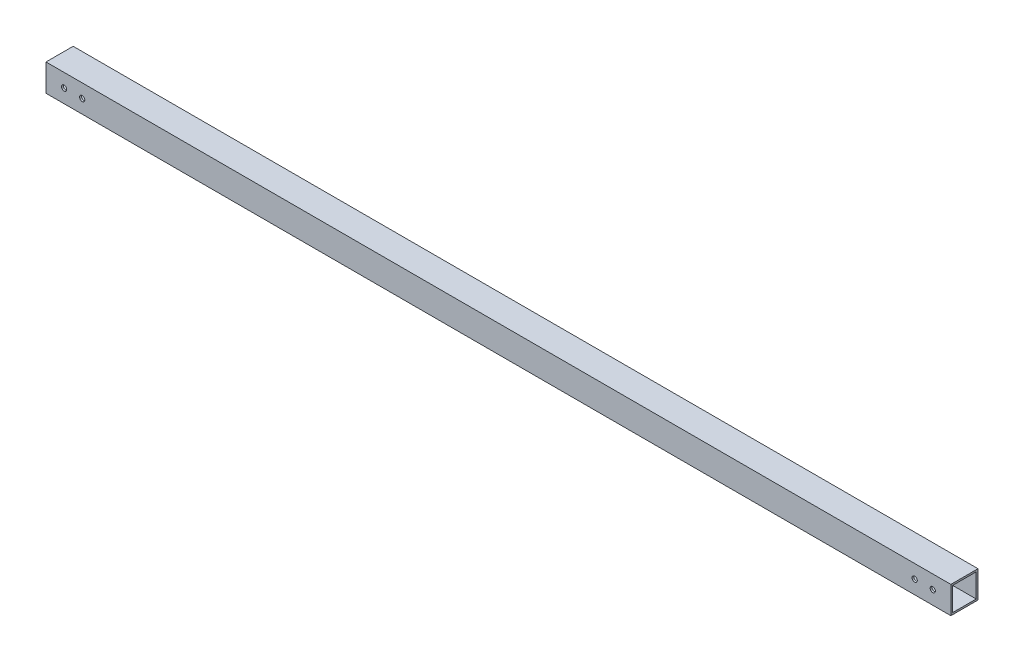
ISO-10303-21;
HEADER;
FILE_DESCRIPTION(('STEP AP214'),'2;1');
FILE_NAME('part.step','',(''),(''),'','','');
FILE_SCHEMA(('AUTOMOTIVE_DESIGN { 1 0 10303 214 1 1 1 1 }'));
ENDSEC;
DATA;
#1=APPLICATION_CONTEXT('core data for automotive mechanical design processes');
#2=APPLICATION_PROTOCOL_DEFINITION('international standard','automotive_design',2000,#1);
#3=PRODUCT_CONTEXT('',#1,'mechanical');
#4=PRODUCT('Part','Part','',(#3));
#5=PRODUCT_RELATED_PRODUCT_CATEGORY('part','',(#4));
#6=PRODUCT_DEFINITION_FORMATION('','',#4);
#7=PRODUCT_DEFINITION_CONTEXT('part definition',#1,'design');
#8=PRODUCT_DEFINITION('design','',#6,#7);
#9=PRODUCT_DEFINITION_SHAPE('','',#8);
#10=(LENGTH_UNIT() NAMED_UNIT(*) SI_UNIT(.MILLI.,.METRE.));
#11=(NAMED_UNIT(*) PLANE_ANGLE_UNIT() SI_UNIT($,.RADIAN.));
#12=(NAMED_UNIT(*) SI_UNIT($,.STERADIAN.) SOLID_ANGLE_UNIT());
#13=UNCERTAINTY_MEASURE_WITH_UNIT(LENGTH_MEASURE(1.E-05),#10,'distance_accuracy_value','');
#14=(GEOMETRIC_REPRESENTATION_CONTEXT(3) GLOBAL_UNCERTAINTY_ASSIGNED_CONTEXT((#13)) GLOBAL_UNIT_ASSIGNED_CONTEXT((#10,
#11,#12)) REPRESENTATION_CONTEXT('',''));
#15=CARTESIAN_POINT('',(0.,0.,0.));
#16=DIRECTION('',(0.,0.,1.));
#17=DIRECTION('',(1.,0.,0.));
#18=AXIS2_PLACEMENT_3D('',#15,#16,#17);
#19=CARTESIAN_POINT('',(500.,0.,0.));
#20=DIRECTION('',(-1.,0.,0.));
#21=DIRECTION('',(0.,0.,1.));
#22=AXIS2_PLACEMENT_3D('',#19,#20,#21);
#23=PLANE('',#22);
#24=DIRECTION('',(0.,1.,0.));
#25=VECTOR('',#24,1.);
#26=CARTESIAN_POINT('',(500.,-7.5,-7.5));
#27=LINE('',#26,#25);
#28=CARTESIAN_POINT('',(500.,-7.5,-7.5));
#29=VERTEX_POINT('',#28);
#30=CARTESIAN_POINT('',(500.,7.5,-7.5));
#31=VERTEX_POINT('',#30);
#32=EDGE_CURVE('E146',#29,#31,#27,.T.);
#33=ORIENTED_EDGE('',*,*,#32,.T.);
#34=DIRECTION('',(0.,0.,1.));
#35=VECTOR('',#34,1.);
#36=CARTESIAN_POINT('',(500.,7.5,7.5));
#37=LINE('',#36,#35);
#38=CARTESIAN_POINT('',(500.,7.5,7.5));
#39=VERTEX_POINT('',#38);
#40=EDGE_CURVE('E149',#31,#39,#37,.T.);
#41=ORIENTED_EDGE('',*,*,#40,.T.);
#42=DIRECTION('',(0.,-1.,0.));
#43=VECTOR('',#42,1.);
#44=CARTESIAN_POINT('',(500.,-7.5,7.5));
#45=LINE('',#44,#43);
#46=CARTESIAN_POINT('',(500.,-7.5,7.5));
#47=VERTEX_POINT('',#46);
#48=EDGE_CURVE('E152',#39,#47,#45,.T.);
#49=ORIENTED_EDGE('',*,*,#48,.T.);
#50=DIRECTION('',(0.,0.,-1.));
#51=VECTOR('',#50,1.);
#52=CARTESIAN_POINT('',(500.,-7.5,7.5));
#53=LINE('',#52,#51);
#54=EDGE_CURVE('E154',#47,#29,#53,.T.);
#55=ORIENTED_EDGE('',*,*,#54,.T.);
#56=EDGE_LOOP('',(#33,#41,#49,#55));
#57=FACE_BOUND('',#56,.T.);
#58=DIRECTION('',(0.,0.,-1.));
#59=VECTOR('',#58,1.);
#60=CARTESIAN_POINT('',(500.,-6.5,6.5));
#61=LINE('',#60,#59);
#62=CARTESIAN_POINT('',(500.,-6.5,6.5));
#63=VERTEX_POINT('',#62);
#64=CARTESIAN_POINT('',(500.,-6.5,-6.5));
#65=VERTEX_POINT('',#64);
#66=EDGE_CURVE('E108',#63,#65,#61,.T.);
#67=ORIENTED_EDGE('',*,*,#66,.F.);
#68=DIRECTION('',(0.,-1.,0.));
#69=VECTOR('',#68,1.);
#70=CARTESIAN_POINT('',(500.,-6.5,6.5));
#71=LINE('',#70,#69);
#72=CARTESIAN_POINT('',(500.,6.5,6.5));
#73=VERTEX_POINT('',#72);
#74=EDGE_CURVE('E130',#73,#63,#71,.T.);
#75=ORIENTED_EDGE('',*,*,#74,.F.);
#76=DIRECTION('',(0.,0.,1.));
#77=VECTOR('',#76,1.);
#78=CARTESIAN_POINT('',(500.,6.5,6.5));
#79=LINE('',#78,#77);
#80=CARTESIAN_POINT('',(500.,6.5,-6.5));
#81=VERTEX_POINT('',#80);
#82=EDGE_CURVE('E128',#81,#73,#79,.T.);
#83=ORIENTED_EDGE('',*,*,#82,.F.);
#84=DIRECTION('',(0.,1.,0.));
#85=VECTOR('',#84,1.);
#86=CARTESIAN_POINT('',(500.,-6.5,-6.5));
#87=LINE('',#86,#85);
#88=EDGE_CURVE('E116',#65,#81,#87,.T.);
#89=ORIENTED_EDGE('',*,*,#88,.F.);
#90=EDGE_LOOP('',(#67,#75,#83,#89));
#91=FACE_BOUND('',#90,.T.);
#92=ADVANCED_FACE('F41',(#57,#91),#23,.F.);
#93=CARTESIAN_POINT('',(0.,0.,0.));
#94=DIRECTION('',(-1.,0.,0.));
#95=DIRECTION('',(0.,0.,1.));
#96=AXIS2_PLACEMENT_3D('',#93,#94,#95);
#97=PLANE('',#96);
#98=DIRECTION('',(0.,1.,0.));
#99=VECTOR('',#98,1.);
#100=CARTESIAN_POINT('',(0.,-7.5,-7.5));
#101=LINE('',#100,#99);
#102=CARTESIAN_POINT('',(0.,-7.5,-7.5));
#103=VERTEX_POINT('',#102);
#104=CARTESIAN_POINT('',(0.,7.5,-7.5));
#105=VERTEX_POINT('',#104);
#106=EDGE_CURVE('E124',#103,#105,#101,.T.);
#107=ORIENTED_EDGE('',*,*,#106,.F.);
#108=DIRECTION('',(0.,0.,-1.));
#109=VECTOR('',#108,1.);
#110=CARTESIAN_POINT('',(0.,-7.5,7.5));
#111=LINE('',#110,#109);
#112=CARTESIAN_POINT('',(0.,-7.5,7.5));
#113=VERTEX_POINT('',#112);
#114=EDGE_CURVE('E150',#113,#103,#111,.T.);
#115=ORIENTED_EDGE('',*,*,#114,.F.);
#116=DIRECTION('',(0.,-1.,0.));
#117=VECTOR('',#116,1.);
#118=CARTESIAN_POINT('',(0.,-7.5,7.5));
#119=LINE('',#118,#117);
#120=CARTESIAN_POINT('',(0.,7.5,7.5));
#121=VERTEX_POINT('',#120);
#122=EDGE_CURVE('E161',#121,#113,#119,.T.);
#123=ORIENTED_EDGE('',*,*,#122,.F.);
#124=DIRECTION('',(0.,0.,1.));
#125=VECTOR('',#124,1.);
#126=CARTESIAN_POINT('',(0.,7.5,7.5));
#127=LINE('',#126,#125);
#128=EDGE_CURVE('E159',#105,#121,#127,.T.);
#129=ORIENTED_EDGE('',*,*,#128,.F.);
#130=EDGE_LOOP('',(#107,#115,#123,#129));
#131=FACE_BOUND('',#130,.T.);
#132=DIRECTION('',(0.,-1.,0.));
#133=VECTOR('',#132,1.);
#134=CARTESIAN_POINT('',(0.,-6.5,6.5));
#135=LINE('',#134,#133);
#136=CARTESIAN_POINT('',(0.,6.5,6.5));
#137=VERTEX_POINT('',#136);
#138=CARTESIAN_POINT('',(0.,-6.5,6.5));
#139=VERTEX_POINT('',#138);
#140=EDGE_CURVE('E117',#137,#139,#135,.T.);
#141=ORIENTED_EDGE('',*,*,#140,.T.);
#142=DIRECTION('',(0.,0.,-1.));
#143=VECTOR('',#142,1.);
#144=CARTESIAN_POINT('',(0.,-6.5,6.5));
#145=LINE('',#144,#143);
#146=CARTESIAN_POINT('',(0.,-6.5,-6.5));
#147=VERTEX_POINT('',#146);
#148=EDGE_CURVE('E66',#139,#147,#145,.T.);
#149=ORIENTED_EDGE('',*,*,#148,.T.);
#150=DIRECTION('',(0.,1.,0.));
#151=VECTOR('',#150,1.);
#152=CARTESIAN_POINT('',(0.,-6.5,-6.5));
#153=LINE('',#152,#151);
#154=CARTESIAN_POINT('',(0.,6.5,-6.5));
#155=VERTEX_POINT('',#154);
#156=EDGE_CURVE('E123',#147,#155,#153,.T.);
#157=ORIENTED_EDGE('',*,*,#156,.T.);
#158=DIRECTION('',(0.,0.,1.));
#159=VECTOR('',#158,1.);
#160=CARTESIAN_POINT('',(0.,6.5,6.5));
#161=LINE('',#160,#159);
#162=EDGE_CURVE('E138',#155,#137,#161,.T.);
#163=ORIENTED_EDGE('',*,*,#162,.T.);
#164=EDGE_LOOP('',(#141,#149,#157,#163));
#165=FACE_BOUND('',#164,.T.);
#166=ADVANCED_FACE('F213',(#131,#165),#97,.T.);
#167=CARTESIAN_POINT('',(500.,-7.5,-7.5));
#168=DIRECTION('',(0.,0.,1.));
#169=DIRECTION('',(1.,0.,0.));
#170=AXIS2_PLACEMENT_3D('',#167,#168,#169);
#171=PLANE('',#170);
#172=CARTESIAN_POINT('',(489.999999999997,-6.17561557447743E-12,-7.5));
#173=DIRECTION('',(0.,0.,1.));
#174=DIRECTION('',(1.,0.,0.));
#175=AXIS2_PLACEMENT_3D('',#172,#173,#174);
#176=CIRCLE('',#175,1.45);
#177=CARTESIAN_POINT('',(491.449999999997,-6.17561557447743E-12,-7.5));
#178=VERTEX_POINT('',#177);
#179=EDGE_CURVE('E175',#178,#178,#176,.T.);
#180=ORIENTED_EDGE('',*,*,#179,.T.);
#181=EDGE_LOOP('',(#180));
#182=FACE_BOUND('',#181,.T.);
#183=CARTESIAN_POINT('',(20.0000000000065,-1.78329573330416E-11,-7.5));
#184=DIRECTION('',(0.,0.,1.));
#185=DIRECTION('',(1.,0.,0.));
#186=AXIS2_PLACEMENT_3D('',#183,#184,#185);
#187=CIRCLE('',#186,1.45000000000113);
#188=CARTESIAN_POINT('',(21.4500000000076,-1.78329573330416E-11,-7.5));
#189=VERTEX_POINT('',#188);
#190=EDGE_CURVE('E267',#189,#189,#187,.T.);
#191=ORIENTED_EDGE('',*,*,#190,.T.);
#192=EDGE_LOOP('',(#191));
#193=FACE_BOUND('',#192,.T.);
#194=CARTESIAN_POINT('',(10.0000000000065,-1.78884684842728E-11,-7.5));
#195=DIRECTION('',(0.,0.,1.));
#196=DIRECTION('',(1.,0.,0.));
#197=AXIS2_PLACEMENT_3D('',#194,#195,#196);
#198=CIRCLE('',#197,1.45000000000114);
#199=CARTESIAN_POINT('',(11.4500000000076,-1.78884684842728E-11,-7.5));
#200=VERTEX_POINT('',#199);
#201=EDGE_CURVE('E271',#200,#200,#198,.T.);
#202=ORIENTED_EDGE('',*,*,#201,.T.);
#203=EDGE_LOOP('',(#202));
#204=FACE_BOUND('',#203,.T.);
#205=CARTESIAN_POINT('',(479.999999999997,-6.10622663543836E-12,-7.5));
#206=DIRECTION('',(0.,0.,1.));
#207=DIRECTION('',(1.,0.,0.));
#208=AXIS2_PLACEMENT_3D('',#205,#206,#207);
#209=CIRCLE('',#208,1.45000000000023);
#210=CARTESIAN_POINT('',(481.449999999997,-6.10622663543836E-12,-7.5));
#211=VERTEX_POINT('',#210);
#212=EDGE_CURVE('E274',#211,#211,#209,.T.);
#213=ORIENTED_EDGE('',*,*,#212,.T.);
#214=EDGE_LOOP('',(#213));
#215=FACE_BOUND('',#214,.T.);
#216=ORIENTED_EDGE('',*,*,#106,.T.);
#217=DIRECTION('',(-1.,0.,0.));
#218=VECTOR('',#217,1.);
#219=CARTESIAN_POINT('',(500.,7.5,-7.5));
#220=LINE('',#219,#218);
#221=EDGE_CURVE('E11',#31,#105,#220,.T.);
#222=ORIENTED_EDGE('',*,*,#221,.F.);
#223=ORIENTED_EDGE('',*,*,#32,.F.);
#224=DIRECTION('',(-1.,0.,0.));
#225=VECTOR('',#224,1.);
#226=CARTESIAN_POINT('',(500.,-7.5,-7.5));
#227=LINE('',#226,#225);
#228=EDGE_CURVE('E156',#29,#103,#227,.T.);
#229=ORIENTED_EDGE('',*,*,#228,.T.);
#230=EDGE_LOOP('',(#216,#222,#223,#229));
#231=FACE_BOUND('',#230,.T.);
#232=ADVANCED_FACE('F43',(#182,#193,#204,#215,#231),#171,.F.);
#233=CARTESIAN_POINT('',(500.,7.5,7.5));
#234=DIRECTION('',(0.,-1.,0.));
#235=DIRECTION('',(0.,0.,-1.));
#236=AXIS2_PLACEMENT_3D('',#233,#234,#235);
#237=PLANE('',#236);
#238=ORIENTED_EDGE('',*,*,#128,.T.);
#239=DIRECTION('',(-1.,0.,0.));
#240=VECTOR('',#239,1.);
#241=CARTESIAN_POINT('',(500.,7.5,7.5));
#242=LINE('',#241,#240);
#243=EDGE_CURVE('E50',#39,#121,#242,.T.);
#244=ORIENTED_EDGE('',*,*,#243,.F.);
#245=ORIENTED_EDGE('',*,*,#40,.F.);
#246=ORIENTED_EDGE('',*,*,#221,.T.);
#247=EDGE_LOOP('',(#238,#244,#245,#246));
#248=FACE_BOUND('',#247,.T.);
#249=ADVANCED_FACE('F240',(#248),#237,.F.);
#250=CARTESIAN_POINT('',(500.,-7.5,7.5));
#251=DIRECTION('',(0.,0.,-1.));
#252=DIRECTION('',(-1.,0.,0.));
#253=AXIS2_PLACEMENT_3D('',#250,#251,#252);
#254=PLANE('',#253);
#255=CARTESIAN_POINT('',(489.999999999997,-6.17561557447743E-12,7.5));
#256=DIRECTION('',(0.,0.,1.));
#257=DIRECTION('',(1.,0.,0.));
#258=AXIS2_PLACEMENT_3D('',#255,#256,#257);
#259=CIRCLE('',#258,1.45);
#260=CARTESIAN_POINT('',(491.449999999997,-6.17561557447743E-12,7.5));
#261=VERTEX_POINT('',#260);
#262=EDGE_CURVE('E280',#261,#261,#259,.T.);
#263=ORIENTED_EDGE('',*,*,#262,.F.);
#264=EDGE_LOOP('',(#263));
#265=FACE_BOUND('',#264,.T.);
#266=CARTESIAN_POINT('',(20.0000000000065,-1.78329573330416E-11,7.5));
#267=DIRECTION('',(0.,0.,1.));
#268=DIRECTION('',(1.,0.,0.));
#269=AXIS2_PLACEMENT_3D('',#266,#267,#268);
#270=CIRCLE('',#269,1.45000000000113);
#271=CARTESIAN_POINT('',(21.4500000000076,-1.78329573330416E-11,7.5));
#272=VERTEX_POINT('',#271);
#273=EDGE_CURVE('E285',#272,#272,#270,.T.);
#274=ORIENTED_EDGE('',*,*,#273,.F.);
#275=EDGE_LOOP('',(#274));
#276=FACE_BOUND('',#275,.T.);
#277=CARTESIAN_POINT('',(10.0000000000065,-1.78884684842728E-11,7.5));
#278=DIRECTION('',(0.,0.,1.));
#279=DIRECTION('',(1.,0.,0.));
#280=AXIS2_PLACEMENT_3D('',#277,#278,#279);
#281=CIRCLE('',#280,1.45000000000114);
#282=CARTESIAN_POINT('',(11.4500000000076,-1.78884684842728E-11,7.5));
#283=VERTEX_POINT('',#282);
#284=EDGE_CURVE('E277',#283,#283,#281,.T.);
#285=ORIENTED_EDGE('',*,*,#284,.F.);
#286=EDGE_LOOP('',(#285));
#287=FACE_BOUND('',#286,.T.);
#288=CARTESIAN_POINT('',(479.999999999997,-6.10622663543836E-12,7.5));
#289=DIRECTION('',(0.,0.,1.));
#290=DIRECTION('',(1.,0.,0.));
#291=AXIS2_PLACEMENT_3D('',#288,#289,#290);
#292=CIRCLE('',#291,1.45000000000023);
#293=CARTESIAN_POINT('',(481.449999999997,-6.10622663543836E-12,7.5));
#294=VERTEX_POINT('',#293);
#295=EDGE_CURVE('E276',#294,#294,#292,.T.);
#296=ORIENTED_EDGE('',*,*,#295,.F.);
#297=EDGE_LOOP('',(#296));
#298=FACE_BOUND('',#297,.T.);
#299=ORIENTED_EDGE('',*,*,#122,.T.);
#300=DIRECTION('',(-1.,0.,0.));
#301=VECTOR('',#300,1.);
#302=CARTESIAN_POINT('',(500.,-7.5,7.5));
#303=LINE('',#302,#301);
#304=EDGE_CURVE('E166',#47,#113,#303,.T.);
#305=ORIENTED_EDGE('',*,*,#304,.F.);
#306=ORIENTED_EDGE('',*,*,#48,.F.);
#307=ORIENTED_EDGE('',*,*,#243,.T.);
#308=EDGE_LOOP('',(#299,#305,#306,#307));
#309=FACE_BOUND('',#308,.T.);
#310=ADVANCED_FACE('F237',(#265,#276,#287,#298,#309),#254,.F.);
#311=CARTESIAN_POINT('',(500.,-7.5,7.5));
#312=DIRECTION('',(0.,1.,0.));
#313=DIRECTION('',(0.,0.,1.));
#314=AXIS2_PLACEMENT_3D('',#311,#312,#313);
#315=PLANE('',#314);
#316=ORIENTED_EDGE('',*,*,#114,.T.);
#317=ORIENTED_EDGE('',*,*,#228,.F.);
#318=ORIENTED_EDGE('',*,*,#54,.F.);
#319=ORIENTED_EDGE('',*,*,#304,.T.);
#320=EDGE_LOOP('',(#316,#317,#318,#319));
#321=FACE_BOUND('',#320,.T.);
#322=ADVANCED_FACE('F234',(#321),#315,.F.);
#323=CARTESIAN_POINT('',(500.,-6.5,6.5));
#324=DIRECTION('',(0.,1.,0.));
#325=DIRECTION('',(0.,0.,1.));
#326=AXIS2_PLACEMENT_3D('',#323,#324,#325);
#327=PLANE('',#326);
#328=ORIENTED_EDGE('',*,*,#148,.F.);
#329=DIRECTION('',(-1.,0.,0.));
#330=VECTOR('',#329,1.);
#331=CARTESIAN_POINT('',(500.,-6.5,6.5));
#332=LINE('',#331,#330);
#333=EDGE_CURVE('E112',#63,#139,#332,.T.);
#334=ORIENTED_EDGE('',*,*,#333,.F.);
#335=ORIENTED_EDGE('',*,*,#66,.T.);
#336=DIRECTION('',(-1.,0.,0.));
#337=VECTOR('',#336,1.);
#338=CARTESIAN_POINT('',(500.,-6.5,-6.5));
#339=LINE('',#338,#337);
#340=EDGE_CURVE('E111',#65,#147,#339,.T.);
#341=ORIENTED_EDGE('',*,*,#340,.T.);
#342=EDGE_LOOP('',(#328,#334,#335,#341));
#343=FACE_BOUND('',#342,.T.);
#344=ADVANCED_FACE('F110',(#343),#327,.T.);
#345=CARTESIAN_POINT('',(500.,-6.5,-6.5));
#346=DIRECTION('',(0.,0.,1.));
#347=DIRECTION('',(0.,-1.,0.));
#348=AXIS2_PLACEMENT_3D('',#345,#346,#347);
#349=PLANE('',#348);
#350=CARTESIAN_POINT('',(489.999999999997,-6.17561557447743E-12,-6.5));
#351=DIRECTION('',(0.,0.,1.));
#352=DIRECTION('',(0.,-1.,0.));
#353=AXIS2_PLACEMENT_3D('',#350,#351,#352);
#354=CIRCLE('',#353,1.45);
#355=CARTESIAN_POINT('',(489.999999999997,-1.45000000000618,-6.5));
#356=VERTEX_POINT('',#355);
#357=EDGE_CURVE('E136',#356,#356,#354,.T.);
#358=ORIENTED_EDGE('',*,*,#357,.F.);
#359=EDGE_LOOP('',(#358));
#360=FACE_BOUND('',#359,.T.);
#361=CARTESIAN_POINT('',(20.0000000000065,-1.78329573330416E-11,-6.5));
#362=DIRECTION('',(0.,0.,1.));
#363=DIRECTION('',(0.,-1.,0.));
#364=AXIS2_PLACEMENT_3D('',#361,#362,#363);
#365=CIRCLE('',#364,1.45000000000113);
#366=CARTESIAN_POINT('',(20.0000000000065,-1.45000000001896,-6.5));
#367=VERTEX_POINT('',#366);
#368=EDGE_CURVE('E181',#367,#367,#365,.T.);
#369=ORIENTED_EDGE('',*,*,#368,.F.);
#370=EDGE_LOOP('',(#369));
#371=FACE_BOUND('',#370,.T.);
#372=CARTESIAN_POINT('',(10.0000000000065,-1.78884684842728E-11,-6.5));
#373=DIRECTION('',(0.,0.,1.));
#374=DIRECTION('',(0.,-1.,0.));
#375=AXIS2_PLACEMENT_3D('',#372,#373,#374);
#376=CIRCLE('',#375,1.45000000000114);
#377=CARTESIAN_POINT('',(10.0000000000065,-1.45000000001903,-6.5));
#378=VERTEX_POINT('',#377);
#379=EDGE_CURVE('E178',#378,#378,#376,.T.);
#380=ORIENTED_EDGE('',*,*,#379,.F.);
#381=EDGE_LOOP('',(#380));
#382=FACE_BOUND('',#381,.T.);
#383=CARTESIAN_POINT('',(479.999999999997,-6.10622663543836E-12,-6.5));
#384=DIRECTION('',(0.,0.,1.));
#385=DIRECTION('',(0.,-1.,0.));
#386=AXIS2_PLACEMENT_3D('',#383,#384,#385);
#387=CIRCLE('',#386,1.45000000000023);
#388=CARTESIAN_POINT('',(479.999999999997,-1.45000000000634,-6.5));
#389=VERTEX_POINT('',#388);
#390=EDGE_CURVE('E174',#389,#389,#387,.T.);
#391=ORIENTED_EDGE('',*,*,#390,.F.);
#392=EDGE_LOOP('',(#391));
#393=FACE_BOUND('',#392,.T.);
#394=ORIENTED_EDGE('',*,*,#156,.F.);
#395=ORIENTED_EDGE('',*,*,#340,.F.);
#396=ORIENTED_EDGE('',*,*,#88,.T.);
#397=DIRECTION('',(-1.,0.,0.));
#398=VECTOR('',#397,1.);
#399=CARTESIAN_POINT('',(500.,6.5,-6.5));
#400=LINE('',#399,#398);
#401=EDGE_CURVE('E125',#81,#155,#400,.T.);
#402=ORIENTED_EDGE('',*,*,#401,.T.);
#403=EDGE_LOOP('',(#394,#395,#396,#402));
#404=FACE_BOUND('',#403,.T.);
#405=ADVANCED_FACE('F120',(#360,#371,#382,#393,#404),#349,.T.);
#406=CARTESIAN_POINT('',(500.,6.5,6.5));
#407=DIRECTION('',(0.,-1.,0.));
#408=DIRECTION('',(0.,0.,-1.));
#409=AXIS2_PLACEMENT_3D('',#406,#407,#408);
#410=PLANE('',#409);
#411=ORIENTED_EDGE('',*,*,#162,.F.);
#412=ORIENTED_EDGE('',*,*,#401,.F.);
#413=ORIENTED_EDGE('',*,*,#82,.T.);
#414=DIRECTION('',(-1.,0.,0.));
#415=VECTOR('',#414,1.);
#416=CARTESIAN_POINT('',(500.,6.5,6.5));
#417=LINE('',#416,#415);
#418=EDGE_CURVE('E58',#73,#137,#417,.T.);
#419=ORIENTED_EDGE('',*,*,#418,.T.);
#420=EDGE_LOOP('',(#411,#412,#413,#419));
#421=FACE_BOUND('',#420,.T.);
#422=ADVANCED_FACE('F205',(#421),#410,.T.);
#423=CARTESIAN_POINT('',(500.,-6.5,6.5));
#424=DIRECTION('',(0.,0.,-1.));
#425=DIRECTION('',(-1.,0.,0.));
#426=AXIS2_PLACEMENT_3D('',#423,#424,#425);
#427=PLANE('',#426);
#428=CARTESIAN_POINT('',(489.999999999997,-6.17561557447743E-12,6.5));
#429=DIRECTION('',(0.,0.,-1.));
#430=DIRECTION('',(-1.,0.,0.));
#431=AXIS2_PLACEMENT_3D('',#428,#429,#430);
#432=CIRCLE('',#431,1.45);
#433=CARTESIAN_POINT('',(488.549999999997,-6.17561557447743E-12,6.5));
#434=VERTEX_POINT('',#433);
#435=EDGE_CURVE('E45',#434,#434,#432,.T.);
#436=ORIENTED_EDGE('',*,*,#435,.F.);
#437=EDGE_LOOP('',(#436));
#438=FACE_BOUND('',#437,.T.);
#439=CARTESIAN_POINT('',(20.0000000000065,-1.78329573330416E-11,6.5));
#440=DIRECTION('',(0.,0.,-1.));
#441=DIRECTION('',(-1.,0.,0.));
#442=AXIS2_PLACEMENT_3D('',#439,#440,#441);
#443=CIRCLE('',#442,1.45000000000113);
#444=CARTESIAN_POINT('',(18.5500000000054,-1.78329573330416E-11,6.5));
#445=VERTEX_POINT('',#444);
#446=EDGE_CURVE('E179',#445,#445,#443,.T.);
#447=ORIENTED_EDGE('',*,*,#446,.F.);
#448=EDGE_LOOP('',(#447));
#449=FACE_BOUND('',#448,.T.);
#450=CARTESIAN_POINT('',(10.0000000000065,-1.78884684842728E-11,6.5));
#451=DIRECTION('',(0.,0.,-1.));
#452=DIRECTION('',(-1.,0.,0.));
#453=AXIS2_PLACEMENT_3D('',#450,#451,#452);
#454=CIRCLE('',#453,1.45000000000114);
#455=CARTESIAN_POINT('',(8.55000000000534,-1.78884684842728E-11,6.5));
#456=VERTEX_POINT('',#455);
#457=EDGE_CURVE('E176',#456,#456,#454,.T.);
#458=ORIENTED_EDGE('',*,*,#457,.F.);
#459=EDGE_LOOP('',(#458));
#460=FACE_BOUND('',#459,.T.);
#461=CARTESIAN_POINT('',(479.999999999997,-6.10622663543836E-12,6.5));
#462=DIRECTION('',(0.,0.,-1.));
#463=DIRECTION('',(-1.,0.,0.));
#464=AXIS2_PLACEMENT_3D('',#461,#462,#463);
#465=CIRCLE('',#464,1.45000000000023);
#466=CARTESIAN_POINT('',(478.549999999996,-6.10622663543836E-12,6.5));
#467=VERTEX_POINT('',#466);
#468=EDGE_CURVE('E171',#467,#467,#465,.T.);
#469=ORIENTED_EDGE('',*,*,#468,.F.);
#470=EDGE_LOOP('',(#469));
#471=FACE_BOUND('',#470,.T.);
#472=ORIENTED_EDGE('',*,*,#140,.F.);
#473=ORIENTED_EDGE('',*,*,#418,.F.);
#474=ORIENTED_EDGE('',*,*,#74,.T.);
#475=ORIENTED_EDGE('',*,*,#333,.T.);
#476=EDGE_LOOP('',(#472,#473,#474,#475));
#477=FACE_BOUND('',#476,.T.);
#478=ADVANCED_FACE('F201',(#438,#449,#460,#471,#477),#427,.T.);
#479=CARTESIAN_POINT('',(479.999999999997,-6.10622663543836E-12,-7.5));
#480=DIRECTION('',(0.,0.,1.));
#481=DIRECTION('',(1.,0.,0.));
#482=AXIS2_PLACEMENT_3D('',#479,#480,#481);
#483=CYLINDRICAL_SURFACE('',#482,1.45000000000023);
#484=ORIENTED_EDGE('',*,*,#468,.T.);
#485=EDGE_LOOP('',(#484));
#486=FACE_BOUND('',#485,.T.);
#487=ORIENTED_EDGE('',*,*,#295,.T.);
#488=EDGE_LOOP('',(#487));
#489=FACE_BOUND('',#488,.T.);
#490=ADVANCED_FACE('F204',(#486,#489),#483,.F.);
#491=CARTESIAN_POINT('',(10.0000000000065,-1.78884684842728E-11,-7.5));
#492=DIRECTION('',(0.,0.,1.));
#493=DIRECTION('',(1.,0.,0.));
#494=AXIS2_PLACEMENT_3D('',#491,#492,#493);
#495=CYLINDRICAL_SURFACE('',#494,1.45000000000114);
#496=ORIENTED_EDGE('',*,*,#457,.T.);
#497=EDGE_LOOP('',(#496));
#498=FACE_BOUND('',#497,.T.);
#499=ORIENTED_EDGE('',*,*,#284,.T.);
#500=EDGE_LOOP('',(#499));
#501=FACE_BOUND('',#500,.T.);
#502=ADVANCED_FACE('F301',(#498,#501),#495,.F.);
#503=CARTESIAN_POINT('',(20.0000000000065,-1.78329573330416E-11,-7.5));
#504=DIRECTION('',(0.,0.,1.));
#505=DIRECTION('',(1.,0.,0.));
#506=AXIS2_PLACEMENT_3D('',#503,#504,#505);
#507=CYLINDRICAL_SURFACE('',#506,1.45000000000113);
#508=ORIENTED_EDGE('',*,*,#446,.T.);
#509=EDGE_LOOP('',(#508));
#510=FACE_BOUND('',#509,.T.);
#511=ORIENTED_EDGE('',*,*,#273,.T.);
#512=EDGE_LOOP('',(#511));
#513=FACE_BOUND('',#512,.T.);
#514=ADVANCED_FACE('F308',(#510,#513),#507,.F.);
#515=CARTESIAN_POINT('',(489.999999999997,-6.17561557447743E-12,-7.5));
#516=DIRECTION('',(0.,0.,1.));
#517=DIRECTION('',(1.,0.,0.));
#518=AXIS2_PLACEMENT_3D('',#515,#516,#517);
#519=CYLINDRICAL_SURFACE('',#518,1.45);
#520=ORIENTED_EDGE('',*,*,#435,.T.);
#521=EDGE_LOOP('',(#520));
#522=FACE_BOUND('',#521,.T.);
#523=ORIENTED_EDGE('',*,*,#262,.T.);
#524=EDGE_LOOP('',(#523));
#525=FACE_BOUND('',#524,.T.);
#526=ADVANCED_FACE('F198',(#522,#525),#519,.F.);
#527=ORIENTED_EDGE('',*,*,#390,.T.);
#528=EDGE_LOOP('',(#527));
#529=FACE_BOUND('',#528,.T.);
#530=ORIENTED_EDGE('',*,*,#212,.F.);
#531=EDGE_LOOP('',(#530));
#532=FACE_BOUND('',#531,.T.);
#533=ADVANCED_FACE('F304',(#529,#532),#483,.F.);
#534=ORIENTED_EDGE('',*,*,#379,.T.);
#535=EDGE_LOOP('',(#534));
#536=FACE_BOUND('',#535,.T.);
#537=ORIENTED_EDGE('',*,*,#201,.F.);
#538=EDGE_LOOP('',(#537));
#539=FACE_BOUND('',#538,.T.);
#540=ADVANCED_FACE('F311',(#536,#539),#495,.F.);
#541=ORIENTED_EDGE('',*,*,#368,.T.);
#542=EDGE_LOOP('',(#541));
#543=FACE_BOUND('',#542,.T.);
#544=ORIENTED_EDGE('',*,*,#190,.F.);
#545=EDGE_LOOP('',(#544));
#546=FACE_BOUND('',#545,.T.);
#547=ADVANCED_FACE('F319',(#543,#546),#507,.F.);
#548=ORIENTED_EDGE('',*,*,#357,.T.);
#549=EDGE_LOOP('',(#548));
#550=FACE_BOUND('',#549,.T.);
#551=ORIENTED_EDGE('',*,*,#179,.F.);
#552=EDGE_LOOP('',(#551));
#553=FACE_BOUND('',#552,.T.);
#554=ADVANCED_FACE('F321',(#550,#553),#519,.F.);
#555=CLOSED_SHELL('',(#92,#166,#232,#249,#310,#322,#344,#405,#422,#478,#490,#502,#514,#526,#533,
#540,#547,#554));
#556=MANIFOLD_SOLID_BREP('B2',#555);
#557=ADVANCED_BREP_SHAPE_REPRESENTATION('',(#18,#556),#14);
#558=SHAPE_DEFINITION_REPRESENTATION(#9,#557);
ENDSEC;
END-ISO-10303-21;
